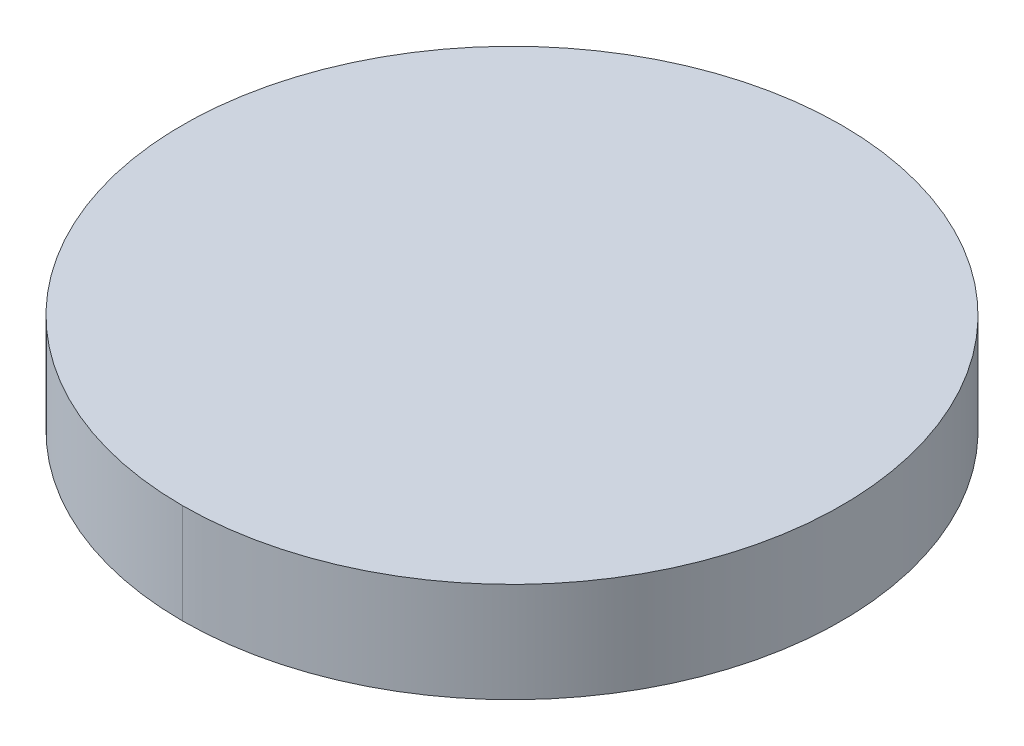
ISO-10303-21;
HEADER;
FILE_DESCRIPTION(('STEP AP214'),'2;1');
FILE_NAME('part.step','',(''),(''),'','','');
FILE_SCHEMA(('AUTOMOTIVE_DESIGN { 1 0 10303 214 1 1 1 1 }'));
ENDSEC;
DATA;
#1=APPLICATION_CONTEXT('core data for automotive mechanical design processes');
#2=APPLICATION_PROTOCOL_DEFINITION('international standard','automotive_design',2000,#1);
#3=PRODUCT_CONTEXT('',#1,'mechanical');
#4=PRODUCT('Part','Part','',(#3));
#5=PRODUCT_RELATED_PRODUCT_CATEGORY('part','',(#4));
#6=PRODUCT_DEFINITION_FORMATION('','',#4);
#7=PRODUCT_DEFINITION_CONTEXT('part definition',#1,'design');
#8=PRODUCT_DEFINITION('design','',#6,#7);
#9=PRODUCT_DEFINITION_SHAPE('','',#8);
#10=(LENGTH_UNIT() NAMED_UNIT(*) SI_UNIT(.MILLI.,.METRE.));
#11=(NAMED_UNIT(*) PLANE_ANGLE_UNIT() SI_UNIT($,.RADIAN.));
#12=(NAMED_UNIT(*) SI_UNIT($,.STERADIAN.) SOLID_ANGLE_UNIT());
#13=UNCERTAINTY_MEASURE_WITH_UNIT(LENGTH_MEASURE(1.E-05),#10,'distance_accuracy_value','');
#14=(GEOMETRIC_REPRESENTATION_CONTEXT(3) GLOBAL_UNCERTAINTY_ASSIGNED_CONTEXT((#13)) GLOBAL_UNIT_ASSIGNED_CONTEXT((#10,
#11,#12)) REPRESENTATION_CONTEXT('',''));
#15=CARTESIAN_POINT('',(0.,0.,0.));
#16=DIRECTION('',(0.,0.,1.));
#17=DIRECTION('',(1.,0.,0.));
#18=AXIS2_PLACEMENT_3D('',#15,#16,#17);
#19=CARTESIAN_POINT('',(0.,0.,0.));
#20=DIRECTION('',(0.,1.,0.));
#21=DIRECTION('',(1.,0.,0.));
#22=AXIS2_PLACEMENT_3D('',#19,#20,#21);
#23=PLANE('',#22);
#24=CARTESIAN_POINT('',(0.,0.,0.));
#25=DIRECTION('',(0.,1.,0.));
#26=DIRECTION('',(0.,0.,1.));
#27=AXIS2_PLACEMENT_3D('',#24,#25,#26);
#28=CIRCLE('',#27,1.65);
#29=CARTESIAN_POINT('',(0.,0.,-1.65));
#30=VERTEX_POINT('',#29);
#31=CARTESIAN_POINT('',(0.,0.,1.65));
#32=VERTEX_POINT('',#31);
#33=EDGE_CURVE('E11',#30,#32,#28,.T.);
#34=ORIENTED_EDGE('',*,*,#33,.F.);
#35=CARTESIAN_POINT('',(0.,0.,0.));
#36=DIRECTION('',(0.,1.,0.));
#37=DIRECTION('',(0.,0.,1.));
#38=AXIS2_PLACEMENT_3D('',#35,#36,#37);
#39=CIRCLE('',#38,1.65);
#40=EDGE_CURVE('E61',#32,#30,#39,.T.);
#41=ORIENTED_EDGE('',*,*,#40,.F.);
#42=EDGE_LOOP('',(#34,#41));
#43=FACE_BOUND('',#42,.T.);
#44=ADVANCED_FACE('F17',(#43),#23,.F.);
#45=CARTESIAN_POINT('',(0.,0.5,0.));
#46=DIRECTION('',(0.,1.,0.));
#47=DIRECTION('',(1.,0.,0.));
#48=AXIS2_PLACEMENT_3D('',#45,#46,#47);
#49=PLANE('',#48);
#50=CARTESIAN_POINT('',(0.,0.5,0.));
#51=DIRECTION('',(0.,1.,0.));
#52=DIRECTION('',(0.,0.,1.));
#53=AXIS2_PLACEMENT_3D('',#50,#51,#52);
#54=CIRCLE('',#53,1.65);
#55=CARTESIAN_POINT('',(0.,0.5,-1.65));
#56=VERTEX_POINT('',#55);
#57=CARTESIAN_POINT('',(0.,0.5,1.65));
#58=VERTEX_POINT('',#57);
#59=EDGE_CURVE('E26',#56,#58,#54,.T.);
#60=ORIENTED_EDGE('',*,*,#59,.T.);
#61=CARTESIAN_POINT('',(0.,0.5,0.));
#62=DIRECTION('',(0.,1.,0.));
#63=DIRECTION('',(0.,0.,1.));
#64=AXIS2_PLACEMENT_3D('',#61,#62,#63);
#65=CIRCLE('',#64,1.65);
#66=EDGE_CURVE('E51',#58,#56,#65,.T.);
#67=ORIENTED_EDGE('',*,*,#66,.T.);
#68=EDGE_LOOP('',(#60,#67));
#69=FACE_BOUND('',#68,.T.);
#70=ADVANCED_FACE('F19',(#69),#49,.T.);
#71=CARTESIAN_POINT('',(0.,0.5,0.));
#72=DIRECTION('',(0.,-1.,0.));
#73=DIRECTION('',(0.,0.,-1.));
#74=AXIS2_PLACEMENT_3D('',#71,#72,#73);
#75=CYLINDRICAL_SURFACE('',#74,1.65);
#76=DIRECTION('',(0.,-1.,0.));
#77=VECTOR('',#76,1.);
#78=CARTESIAN_POINT('',(0.,0.5,1.65));
#79=LINE('',#78,#77);
#80=EDGE_CURVE('E56',#58,#32,#79,.T.);
#81=ORIENTED_EDGE('',*,*,#80,.F.);
#82=ORIENTED_EDGE('',*,*,#59,.F.);
#83=DIRECTION('',(0.,-1.,0.));
#84=VECTOR('',#83,1.);
#85=CARTESIAN_POINT('',(0.,0.5,-1.65));
#86=LINE('',#85,#84);
#87=EDGE_CURVE('E54',#56,#30,#86,.T.);
#88=ORIENTED_EDGE('',*,*,#87,.T.);
#89=ORIENTED_EDGE('',*,*,#33,.T.);
#90=EDGE_LOOP('',(#81,#82,#88,#89));
#91=FACE_BOUND('',#90,.T.);
#92=ADVANCED_FACE('F57',(#91),#75,.T.);
#93=CARTESIAN_POINT('',(0.,0.5,0.));
#94=DIRECTION('',(0.,-1.,0.));
#95=DIRECTION('',(0.,0.,-1.));
#96=AXIS2_PLACEMENT_3D('',#93,#94,#95);
#97=CYLINDRICAL_SURFACE('',#96,1.65);
#98=ORIENTED_EDGE('',*,*,#66,.F.);
#99=ORIENTED_EDGE('',*,*,#80,.T.);
#100=ORIENTED_EDGE('',*,*,#40,.T.);
#101=ORIENTED_EDGE('',*,*,#87,.F.);
#102=EDGE_LOOP('',(#98,#99,#100,#101));
#103=FACE_BOUND('',#102,.T.);
#104=ADVANCED_FACE('F63',(#103),#97,.T.);
#105=CLOSED_SHELL('',(#44,#70,#92,#104));
#106=MANIFOLD_SOLID_BREP('B1',#105);
#107=ADVANCED_BREP_SHAPE_REPRESENTATION('',(#18,#106),#14);
#108=SHAPE_DEFINITION_REPRESENTATION(#9,#107);
ENDSEC;
END-ISO-10303-21;
